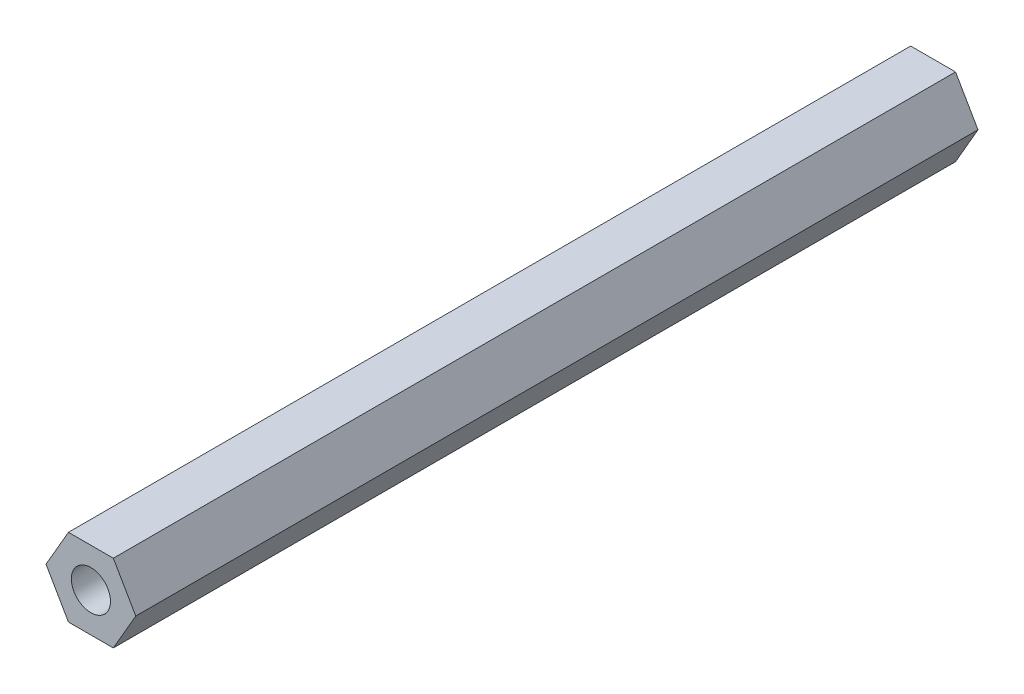
ISO-10303-21;
HEADER;
FILE_DESCRIPTION(('STEP AP214'),'2;1');
FILE_NAME('part.step','',(''),(''),'','','');
FILE_SCHEMA(('AUTOMOTIVE_DESIGN { 1 0 10303 214 1 1 1 1 }'));
ENDSEC;
DATA;
#1=APPLICATION_CONTEXT('core data for automotive mechanical design processes');
#2=APPLICATION_PROTOCOL_DEFINITION('international standard','automotive_design',2000,#1);
#3=PRODUCT_CONTEXT('',#1,'mechanical');
#4=PRODUCT('Part','Part','',(#3));
#5=PRODUCT_RELATED_PRODUCT_CATEGORY('part','',(#4));
#6=PRODUCT_DEFINITION_FORMATION('','',#4);
#7=PRODUCT_DEFINITION_CONTEXT('part definition',#1,'design');
#8=PRODUCT_DEFINITION('design','',#6,#7);
#9=PRODUCT_DEFINITION_SHAPE('','',#8);
#10=(LENGTH_UNIT() NAMED_UNIT(*) SI_UNIT(.MILLI.,.METRE.));
#11=(NAMED_UNIT(*) PLANE_ANGLE_UNIT() SI_UNIT($,.RADIAN.));
#12=(NAMED_UNIT(*) SI_UNIT($,.STERADIAN.) SOLID_ANGLE_UNIT());
#13=UNCERTAINTY_MEASURE_WITH_UNIT(LENGTH_MEASURE(1.E-05),#10,'distance_accuracy_value','');
#14=(GEOMETRIC_REPRESENTATION_CONTEXT(3) GLOBAL_UNCERTAINTY_ASSIGNED_CONTEXT((#13)) GLOBAL_UNIT_ASSIGNED_CONTEXT((#10,
#11,#12)) REPRESENTATION_CONTEXT('',''));
#15=CARTESIAN_POINT('',(0.,0.,0.));
#16=DIRECTION('',(0.,0.,1.));
#17=DIRECTION('',(1.,0.,0.));
#18=AXIS2_PLACEMENT_3D('',#15,#16,#17);
#19=CARTESIAN_POINT('',(1.73205080756888,-3.,65.));
#20=DIRECTION('',(-0.866025403784439,0.5,0.));
#21=DIRECTION('',(-0.5,-0.866025403784439,0.));
#22=AXIS2_PLACEMENT_3D('',#19,#20,#21);
#23=PLANE('',#22);
#24=DIRECTION('',(0.5,0.866025403784439,0.));
#25=VECTOR('',#24,1.);
#26=CARTESIAN_POINT('',(1.73205080756888,-3.,0.));
#27=LINE('',#26,#25);
#28=CARTESIAN_POINT('',(1.73205080756888,-3.,0.));
#29=VERTEX_POINT('',#28);
#30=CARTESIAN_POINT('',(3.46410161513775,0.,0.));
#31=VERTEX_POINT('',#30);
#32=EDGE_CURVE('E124',#29,#31,#27,.T.);
#33=ORIENTED_EDGE('',*,*,#32,.T.);
#34=DIRECTION('',(0.,0.,-1.));
#35=VECTOR('',#34,1.);
#36=CARTESIAN_POINT('',(3.46410161513775,0.,65.));
#37=LINE('',#36,#35);
#38=CARTESIAN_POINT('',(3.46410161513775,0.,65.));
#39=VERTEX_POINT('',#38);
#40=EDGE_CURVE('E11',#39,#31,#37,.T.);
#41=ORIENTED_EDGE('',*,*,#40,.F.);
#42=DIRECTION('',(0.5,0.866025403784439,0.));
#43=VECTOR('',#42,1.);
#44=CARTESIAN_POINT('',(1.73205080756888,-3.,65.));
#45=LINE('',#44,#43);
#46=CARTESIAN_POINT('',(1.73205080756888,-3.,65.));
#47=VERTEX_POINT('',#46);
#48=EDGE_CURVE('E136',#47,#39,#45,.T.);
#49=ORIENTED_EDGE('',*,*,#48,.F.);
#50=DIRECTION('',(0.,0.,-1.));
#51=VECTOR('',#50,1.);
#52=CARTESIAN_POINT('',(1.73205080756888,-3.,65.));
#53=LINE('',#52,#51);
#54=EDGE_CURVE('E121',#47,#29,#53,.T.);
#55=ORIENTED_EDGE('',*,*,#54,.T.);
#56=EDGE_LOOP('',(#33,#41,#49,#55));
#57=FACE_BOUND('',#56,.T.);
#58=ADVANCED_FACE('F41',(#57),#23,.F.);
#59=CARTESIAN_POINT('',(3.46410161513775,0.,65.));
#60=DIRECTION('',(-0.866025403784439,-0.5,0.));
#61=DIRECTION('',(0.5,-0.866025403784439,0.));
#62=AXIS2_PLACEMENT_3D('',#59,#60,#61);
#63=PLANE('',#62);
#64=DIRECTION('',(-0.5,0.866025403784439,0.));
#65=VECTOR('',#64,1.);
#66=CARTESIAN_POINT('',(3.46410161513775,0.,0.));
#67=LINE('',#66,#65);
#68=CARTESIAN_POINT('',(1.73205080756888,3.,0.));
#69=VERTEX_POINT('',#68);
#70=EDGE_CURVE('E126',#31,#69,#67,.T.);
#71=ORIENTED_EDGE('',*,*,#70,.T.);
#72=DIRECTION('',(0.,0.,-1.));
#73=VECTOR('',#72,1.);
#74=CARTESIAN_POINT('',(1.73205080756888,3.,65.));
#75=LINE('',#74,#73);
#76=CARTESIAN_POINT('',(1.73205080756888,3.,65.));
#77=VERTEX_POINT('',#76);
#78=EDGE_CURVE('E47',#77,#69,#75,.T.);
#79=ORIENTED_EDGE('',*,*,#78,.F.);
#80=DIRECTION('',(-0.5,0.866025403784439,0.));
#81=VECTOR('',#80,1.);
#82=CARTESIAN_POINT('',(3.46410161513775,0.,65.));
#83=LINE('',#82,#81);
#84=EDGE_CURVE('E94',#39,#77,#83,.T.);
#85=ORIENTED_EDGE('',*,*,#84,.F.);
#86=ORIENTED_EDGE('',*,*,#40,.T.);
#87=EDGE_LOOP('',(#71,#79,#85,#86));
#88=FACE_BOUND('',#87,.T.);
#89=ADVANCED_FACE('F165',(#88),#63,.F.);
#90=CARTESIAN_POINT('',(1.73205080756888,3.,65.));
#91=DIRECTION('',(0.,-1.,0.));
#92=DIRECTION('',(1.,0.,0.));
#93=AXIS2_PLACEMENT_3D('',#90,#91,#92);
#94=PLANE('',#93);
#95=DIRECTION('',(-1.,0.,0.));
#96=VECTOR('',#95,1.);
#97=CARTESIAN_POINT('',(1.73205080756888,3.,0.));
#98=LINE('',#97,#96);
#99=CARTESIAN_POINT('',(-1.73205080756888,3.,0.));
#100=VERTEX_POINT('',#99);
#101=EDGE_CURVE('E133',#69,#100,#98,.T.);
#102=ORIENTED_EDGE('',*,*,#101,.T.);
#103=DIRECTION('',(0.,0.,-1.));
#104=VECTOR('',#103,1.);
#105=CARTESIAN_POINT('',(-1.73205080756888,3.,65.));
#106=LINE('',#105,#104);
#107=CARTESIAN_POINT('',(-1.73205080756888,3.,65.));
#108=VERTEX_POINT('',#107);
#109=EDGE_CURVE('E118',#108,#100,#106,.T.);
#110=ORIENTED_EDGE('',*,*,#109,.F.);
#111=DIRECTION('',(-1.,0.,0.));
#112=VECTOR('',#111,1.);
#113=CARTESIAN_POINT('',(1.73205080756888,3.,65.));
#114=LINE('',#113,#112);
#115=EDGE_CURVE('E110',#77,#108,#114,.T.);
#116=ORIENTED_EDGE('',*,*,#115,.F.);
#117=ORIENTED_EDGE('',*,*,#78,.T.);
#118=EDGE_LOOP('',(#102,#110,#116,#117));
#119=FACE_BOUND('',#118,.T.);
#120=ADVANCED_FACE('F142',(#119),#94,.F.);
#121=CARTESIAN_POINT('',(-1.73205080756888,3.,65.));
#122=DIRECTION('',(0.866025403784439,-0.5,0.));
#123=DIRECTION('',(0.5,0.866025403784439,0.));
#124=AXIS2_PLACEMENT_3D('',#121,#122,#123);
#125=PLANE('',#124);
#126=DIRECTION('',(-0.5,-0.866025403784439,0.));
#127=VECTOR('',#126,1.);
#128=CARTESIAN_POINT('',(-1.73205080756888,3.,0.));
#129=LINE('',#128,#127);
#130=CARTESIAN_POINT('',(-3.46410161513775,0.,0.));
#131=VERTEX_POINT('',#130);
#132=EDGE_CURVE('E113',#100,#131,#129,.T.);
#133=ORIENTED_EDGE('',*,*,#132,.T.);
#134=DIRECTION('',(0.,0.,-1.));
#135=VECTOR('',#134,1.);
#136=CARTESIAN_POINT('',(-3.46410161513775,0.,65.));
#137=LINE('',#136,#135);
#138=CARTESIAN_POINT('',(-3.46410161513775,0.,65.));
#139=VERTEX_POINT('',#138);
#140=EDGE_CURVE('E115',#139,#131,#137,.T.);
#141=ORIENTED_EDGE('',*,*,#140,.F.);
#142=DIRECTION('',(-0.5,-0.866025403784439,0.));
#143=VECTOR('',#142,1.);
#144=CARTESIAN_POINT('',(-1.73205080756888,3.,65.));
#145=LINE('',#144,#143);
#146=EDGE_CURVE('E101',#108,#139,#145,.T.);
#147=ORIENTED_EDGE('',*,*,#146,.F.);
#148=ORIENTED_EDGE('',*,*,#109,.T.);
#149=EDGE_LOOP('',(#133,#141,#147,#148));
#150=FACE_BOUND('',#149,.T.);
#151=ADVANCED_FACE('F114',(#150),#125,.F.);
#152=CARTESIAN_POINT('',(-3.46410161513775,0.,65.));
#153=DIRECTION('',(0.866025403784439,0.5,0.));
#154=DIRECTION('',(-0.5,0.866025403784439,0.));
#155=AXIS2_PLACEMENT_3D('',#152,#153,#154);
#156=PLANE('',#155);
#157=DIRECTION('',(0.5,-0.866025403784439,0.));
#158=VECTOR('',#157,1.);
#159=CARTESIAN_POINT('',(-3.46410161513775,0.,0.));
#160=LINE('',#159,#158);
#161=CARTESIAN_POINT('',(-1.73205080756888,-3.,0.));
#162=VERTEX_POINT('',#161);
#163=EDGE_CURVE('E79',#131,#162,#160,.T.);
#164=ORIENTED_EDGE('',*,*,#163,.T.);
#165=DIRECTION('',(0.,0.,-1.));
#166=VECTOR('',#165,1.);
#167=CARTESIAN_POINT('',(-1.73205080756888,-3.,65.));
#168=LINE('',#167,#166);
#169=CARTESIAN_POINT('',(-1.73205080756888,-3.,65.));
#170=VERTEX_POINT('',#169);
#171=EDGE_CURVE('E120',#170,#162,#168,.T.);
#172=ORIENTED_EDGE('',*,*,#171,.F.);
#173=DIRECTION('',(0.5,-0.866025403784439,0.));
#174=VECTOR('',#173,1.);
#175=CARTESIAN_POINT('',(-3.46410161513775,0.,65.));
#176=LINE('',#175,#174);
#177=EDGE_CURVE('E104',#139,#170,#176,.T.);
#178=ORIENTED_EDGE('',*,*,#177,.F.);
#179=ORIENTED_EDGE('',*,*,#140,.T.);
#180=EDGE_LOOP('',(#164,#172,#178,#179));
#181=FACE_BOUND('',#180,.T.);
#182=ADVANCED_FACE('F117',(#181),#156,.F.);
#183=CARTESIAN_POINT('',(-1.73205080756888,-3.,65.));
#184=DIRECTION('',(0.,1.,0.));
#185=DIRECTION('',(-1.,0.,0.));
#186=AXIS2_PLACEMENT_3D('',#183,#184,#185);
#187=PLANE('',#186);
#188=DIRECTION('',(1.,0.,0.));
#189=VECTOR('',#188,1.);
#190=CARTESIAN_POINT('',(-1.73205080756888,-3.,0.));
#191=LINE('',#190,#189);
#192=EDGE_CURVE('E88',#162,#29,#191,.T.);
#193=ORIENTED_EDGE('',*,*,#192,.T.);
#194=ORIENTED_EDGE('',*,*,#54,.F.);
#195=DIRECTION('',(1.,0.,0.));
#196=VECTOR('',#195,1.);
#197=CARTESIAN_POINT('',(-1.73205080756888,-3.,65.));
#198=LINE('',#197,#196);
#199=EDGE_CURVE('E60',#170,#47,#198,.T.);
#200=ORIENTED_EDGE('',*,*,#199,.F.);
#201=ORIENTED_EDGE('',*,*,#171,.T.);
#202=EDGE_LOOP('',(#193,#194,#200,#201));
#203=FACE_BOUND('',#202,.T.);
#204=ADVANCED_FACE('F149',(#203),#187,.F.);
#205=CARTESIAN_POINT('',(0.,0.,65.));
#206=DIRECTION('',(0.,0.,1.));
#207=DIRECTION('',(1.,0.,0.));
#208=AXIS2_PLACEMENT_3D('',#205,#206,#207);
#209=PLANE('',#208);
#210=CARTESIAN_POINT('',(0.,0.,65.));
#211=DIRECTION('',(0.,0.,1.));
#212=DIRECTION('',(1.,0.,0.));
#213=AXIS2_PLACEMENT_3D('',#210,#211,#212);
#214=CIRCLE('',#213,1.51);
#215=CARTESIAN_POINT('',(1.51,0.,65.));
#216=VERTEX_POINT('',#215);
#217=EDGE_CURVE('E246',#216,#216,#214,.T.);
#218=ORIENTED_EDGE('',*,*,#217,.F.);
#219=EDGE_LOOP('',(#218));
#220=FACE_BOUND('',#219,.T.);
#221=ORIENTED_EDGE('',*,*,#48,.T.);
#222=ORIENTED_EDGE('',*,*,#84,.T.);
#223=ORIENTED_EDGE('',*,*,#115,.T.);
#224=ORIENTED_EDGE('',*,*,#146,.T.);
#225=ORIENTED_EDGE('',*,*,#177,.T.);
#226=ORIENTED_EDGE('',*,*,#199,.T.);
#227=EDGE_LOOP('',(#221,#222,#223,#224,#225,#226));
#228=FACE_BOUND('',#227,.T.);
#229=ADVANCED_FACE('F103',(#220,#228),#209,.T.);
#230=CARTESIAN_POINT('',(0.,0.,0.));
#231=DIRECTION('',(0.,0.,1.));
#232=DIRECTION('',(1.,0.,0.));
#233=AXIS2_PLACEMENT_3D('',#230,#231,#232);
#234=PLANE('',#233);
#235=CARTESIAN_POINT('',(0.,0.,0.));
#236=DIRECTION('',(0.,0.,-1.));
#237=DIRECTION('',(-1.,0.,0.));
#238=AXIS2_PLACEMENT_3D('',#235,#236,#237);
#239=CIRCLE('',#238,1.51);
#240=CARTESIAN_POINT('',(-1.51,0.,0.));
#241=VERTEX_POINT('',#240);
#242=EDGE_CURVE('E244',#241,#241,#239,.T.);
#243=ORIENTED_EDGE('',*,*,#242,.F.);
#244=EDGE_LOOP('',(#243));
#245=FACE_BOUND('',#244,.T.);
#246=ORIENTED_EDGE('',*,*,#32,.F.);
#247=ORIENTED_EDGE('',*,*,#192,.F.);
#248=ORIENTED_EDGE('',*,*,#163,.F.);
#249=ORIENTED_EDGE('',*,*,#132,.F.);
#250=ORIENTED_EDGE('',*,*,#101,.F.);
#251=ORIENTED_EDGE('',*,*,#70,.F.);
#252=EDGE_LOOP('',(#246,#247,#248,#249,#250,#251));
#253=FACE_BOUND('',#252,.T.);
#254=ADVANCED_FACE('F144',(#245,#253),#234,.F.);
#255=CARTESIAN_POINT('',(0.,0.,8.));
#256=DIRECTION('',(0.,0.,-1.));
#257=DIRECTION('',(-1.,0.,0.));
#258=AXIS2_PLACEMENT_3D('',#255,#256,#257);
#259=CYLINDRICAL_SURFACE('',#258,1.51);
#260=CARTESIAN_POINT('',(0.,0.,8.));
#261=DIRECTION('',(0.,0.,-1.));
#262=DIRECTION('',(-1.,0.,0.));
#263=AXIS2_PLACEMENT_3D('',#260,#261,#262);
#264=CIRCLE('',#263,1.51);
#265=CARTESIAN_POINT('',(-1.51,0.,8.));
#266=VERTEX_POINT('',#265);
#267=EDGE_CURVE('E129',#266,#266,#264,.T.);
#268=ORIENTED_EDGE('',*,*,#267,.F.);
#269=EDGE_LOOP('',(#268));
#270=FACE_BOUND('',#269,.T.);
#271=ORIENTED_EDGE('',*,*,#242,.T.);
#272=EDGE_LOOP('',(#271));
#273=FACE_BOUND('',#272,.T.);
#274=ADVANCED_FACE('F205',(#270,#273),#259,.F.);
#275=CARTESIAN_POINT('',(0.,0.,8.));
#276=DIRECTION('',(0.,0.,-1.));
#277=DIRECTION('',(-1.,0.,0.));
#278=AXIS2_PLACEMENT_3D('',#275,#276,#277);
#279=PLANE('',#278);
#280=ORIENTED_EDGE('',*,*,#267,.T.);
#281=EDGE_LOOP('',(#280));
#282=FACE_BOUND('',#281,.T.);
#283=ADVANCED_FACE('F211',(#282),#279,.T.);
#284=CARTESIAN_POINT('',(0.,0.,57.));
#285=DIRECTION('',(0.,0.,1.));
#286=DIRECTION('',(1.,0.,0.));
#287=AXIS2_PLACEMENT_3D('',#284,#285,#286);
#288=CYLINDRICAL_SURFACE('',#287,1.51);
#289=CARTESIAN_POINT('',(0.,0.,57.));
#290=DIRECTION('',(0.,0.,1.));
#291=DIRECTION('',(1.,0.,0.));
#292=AXIS2_PLACEMENT_3D('',#289,#290,#291);
#293=CIRCLE('',#292,1.51);
#294=CARTESIAN_POINT('',(1.51,0.,57.));
#295=VERTEX_POINT('',#294);
#296=EDGE_CURVE('E242',#295,#295,#293,.T.);
#297=ORIENTED_EDGE('',*,*,#296,.F.);
#298=EDGE_LOOP('',(#297));
#299=FACE_BOUND('',#298,.T.);
#300=ORIENTED_EDGE('',*,*,#217,.T.);
#301=EDGE_LOOP('',(#300));
#302=FACE_BOUND('',#301,.T.);
#303=ADVANCED_FACE('F219',(#299,#302),#288,.F.);
#304=CARTESIAN_POINT('',(0.,0.,57.));
#305=DIRECTION('',(0.,0.,1.));
#306=DIRECTION('',(1.,0.,0.));
#307=AXIS2_PLACEMENT_3D('',#304,#305,#306);
#308=PLANE('',#307);
#309=ORIENTED_EDGE('',*,*,#296,.T.);
#310=EDGE_LOOP('',(#309));
#311=FACE_BOUND('',#310,.T.);
#312=ADVANCED_FACE('F227',(#311),#308,.T.);
#313=CLOSED_SHELL('',(#58,#89,#120,#151,#182,#204,#229,#254,#274,#283,#303,#312));
#314=MANIFOLD_SOLID_BREP('B2',#313);
#315=ADVANCED_BREP_SHAPE_REPRESENTATION('',(#18,#314),#14);
#316=SHAPE_DEFINITION_REPRESENTATION(#9,#315);
ENDSEC;
END-ISO-10303-21;
